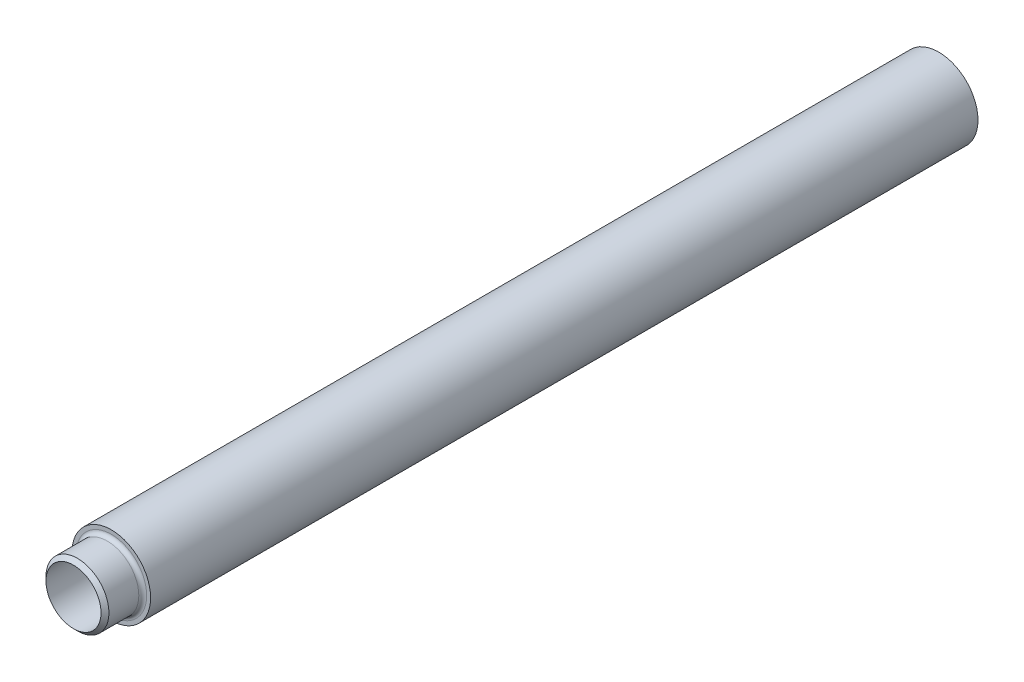
ISO-10303-21;
HEADER;
FILE_DESCRIPTION(('STEP AP214'),'2;1');
FILE_NAME('part.step','',(''),(''),'','','');
FILE_SCHEMA(('AUTOMOTIVE_DESIGN { 1 0 10303 214 1 1 1 1 }'));
ENDSEC;
DATA;
#1=APPLICATION_CONTEXT('core data for automotive mechanical design processes');
#2=APPLICATION_PROTOCOL_DEFINITION('international standard','automotive_design',2000,#1);
#3=PRODUCT_CONTEXT('',#1,'mechanical');
#4=PRODUCT('Part','Part','',(#3));
#5=PRODUCT_RELATED_PRODUCT_CATEGORY('part','',(#4));
#6=PRODUCT_DEFINITION_FORMATION('','',#4);
#7=PRODUCT_DEFINITION_CONTEXT('part definition',#1,'design');
#8=PRODUCT_DEFINITION('design','',#6,#7);
#9=PRODUCT_DEFINITION_SHAPE('','',#8);
#10=(LENGTH_UNIT() NAMED_UNIT(*) SI_UNIT(.MILLI.,.METRE.));
#11=(NAMED_UNIT(*) PLANE_ANGLE_UNIT() SI_UNIT($,.RADIAN.));
#12=(NAMED_UNIT(*) SI_UNIT($,.STERADIAN.) SOLID_ANGLE_UNIT());
#13=UNCERTAINTY_MEASURE_WITH_UNIT(LENGTH_MEASURE(1.E-05),#10,'distance_accuracy_value','');
#14=(GEOMETRIC_REPRESENTATION_CONTEXT(3) GLOBAL_UNCERTAINTY_ASSIGNED_CONTEXT((#13)) GLOBAL_UNIT_ASSIGNED_CONTEXT((#10,
#11,#12)) REPRESENTATION_CONTEXT('',''));
#15=CARTESIAN_POINT('',(0.,0.,0.));
#16=DIRECTION('',(0.,0.,1.));
#17=DIRECTION('',(1.,0.,0.));
#18=AXIS2_PLACEMENT_3D('',#15,#16,#17);
#19=CARTESIAN_POINT('',(0.,0.,279.4));
#20=DIRECTION('',(0.,0.,-1.));
#21=DIRECTION('',(-1.,0.,0.));
#22=AXIS2_PLACEMENT_3D('',#19,#20,#21);
#23=CYLINDRICAL_SURFACE('',#22,12.7);
#24=CARTESIAN_POINT('',(0.,0.,0.));
#25=DIRECTION('',(0.,0.,1.));
#26=DIRECTION('',(1.,0.,0.));
#27=AXIS2_PLACEMENT_3D('',#24,#25,#26);
#28=CIRCLE('',#27,12.7);
#29=CARTESIAN_POINT('',(12.7,0.,0.));
#30=VERTEX_POINT('',#29);
#31=EDGE_CURVE('E65',#30,#30,#28,.T.);
#32=ORIENTED_EDGE('',*,*,#31,.T.);
#33=EDGE_LOOP('',(#32));
#34=FACE_BOUND('',#33,.T.);
#35=CARTESIAN_POINT('',(0.,0.,267.208));
#36=DIRECTION('',(0.,0.,1.));
#37=DIRECTION('',(1.,0.,0.));
#38=AXIS2_PLACEMENT_3D('',#35,#36,#37);
#39=CIRCLE('',#38,12.7);
#40=CARTESIAN_POINT('',(12.7,0.,267.208));
#41=VERTEX_POINT('',#40);
#42=EDGE_CURVE('E70',#41,#41,#39,.T.);
#43=ORIENTED_EDGE('',*,*,#42,.F.);
#44=EDGE_LOOP('',(#43));
#45=FACE_BOUND('',#44,.T.);
#46=ADVANCED_FACE('F35',(#34,#45),#23,.T.);
#47=CARTESIAN_POINT('',(0.,0.,279.4));
#48=DIRECTION('',(0.,0.,-1.));
#49=DIRECTION('',(-1.,0.,0.));
#50=AXIS2_PLACEMENT_3D('',#47,#48,#49);
#51=CYLINDRICAL_SURFACE('',#50,8.89);
#52=CARTESIAN_POINT('',(0.,0.,279.4));
#53=DIRECTION('',(0.,0.,-1.));
#54=DIRECTION('',(-1.,0.,0.));
#55=AXIS2_PLACEMENT_3D('',#52,#53,#54);
#56=CIRCLE('',#55,8.89);
#57=CARTESIAN_POINT('',(-8.89,0.,279.4));
#58=VERTEX_POINT('',#57);
#59=EDGE_CURVE('E69',#58,#58,#56,.T.);
#60=ORIENTED_EDGE('',*,*,#59,.F.);
#61=EDGE_LOOP('',(#60));
#62=FACE_BOUND('',#61,.T.);
#63=CARTESIAN_POINT('',(0.,0.,12.7));
#64=DIRECTION('',(0.,0.,-1.));
#65=DIRECTION('',(-1.,0.,0.));
#66=AXIS2_PLACEMENT_3D('',#63,#64,#65);
#67=CIRCLE('',#66,8.89);
#68=CARTESIAN_POINT('',(-8.89,0.,12.7));
#69=VERTEX_POINT('',#68);
#70=EDGE_CURVE('E66',#69,#69,#67,.F.);
#71=ORIENTED_EDGE('',*,*,#70,.F.);
#72=EDGE_LOOP('',(#71));
#73=FACE_BOUND('',#72,.T.);
#74=ADVANCED_FACE('F81',(#62,#73),#51,.F.);
#75=CARTESIAN_POINT('',(0.,0.,0.));
#76=DIRECTION('',(0.,0.,1.));
#77=DIRECTION('',(1.,0.,0.));
#78=AXIS2_PLACEMENT_3D('',#75,#76,#77);
#79=PLANE('',#78);
#80=CARTESIAN_POINT('',(0.,0.,0.));
#81=DIRECTION('',(0.,0.,1.));
#82=DIRECTION('',(1.,0.,0.));
#83=AXIS2_PLACEMENT_3D('',#80,#81,#82);
#84=CIRCLE('',#83,11.303);
#85=CARTESIAN_POINT('',(11.303,0.,0.));
#86=VERTEX_POINT('',#85);
#87=EDGE_CURVE('E51',#86,#86,#84,.T.);
#88=ORIENTED_EDGE('',*,*,#87,.T.);
#89=EDGE_LOOP('',(#88));
#90=FACE_BOUND('',#89,.T.);
#91=ORIENTED_EDGE('',*,*,#31,.F.);
#92=EDGE_LOOP('',(#91));
#93=FACE_BOUND('',#92,.T.);
#94=ADVANCED_FACE('F87',(#90,#93),#79,.F.);
#95=CARTESIAN_POINT('',(0.,0.,12.7));
#96=DIRECTION('',(0.,0.,-1.));
#97=DIRECTION('',(-1.,0.,0.));
#98=AXIS2_PLACEMENT_3D('',#95,#96,#97);
#99=PLANE('',#98);
#100=CARTESIAN_POINT('',(0.,0.,12.7));
#101=DIRECTION('',(0.,0.,-1.));
#102=DIRECTION('',(-1.,0.,0.));
#103=AXIS2_PLACEMENT_3D('',#100,#101,#102);
#104=CIRCLE('',#103,9.398);
#105=CARTESIAN_POINT('',(-9.398,0.,12.7));
#106=VERTEX_POINT('',#105);
#107=EDGE_CURVE('E47',#106,#106,#104,.T.);
#108=ORIENTED_EDGE('',*,*,#107,.T.);
#109=EDGE_LOOP('',(#108));
#110=FACE_BOUND('',#109,.T.);
#111=ORIENTED_EDGE('',*,*,#70,.T.);
#112=EDGE_LOOP('',(#111));
#113=FACE_BOUND('',#112,.T.);
#114=ADVANCED_FACE('F113',(#110,#113),#99,.T.);
#115=CARTESIAN_POINT('',(0.,0.,12.7));
#116=DIRECTION('',(0.,0.,-1.));
#117=DIRECTION('',(-1.,0.,0.));
#118=AXIS2_PLACEMENT_3D('',#115,#116,#117);
#119=CYLINDRICAL_SURFACE('',#118,10.033);
#120=CARTESIAN_POINT('',(0.,0.,12.065));
#121=DIRECTION('',(0.,0.,-1.));
#122=DIRECTION('',(-1.,0.,0.));
#123=AXIS2_PLACEMENT_3D('',#120,#121,#122);
#124=CIRCLE('',#123,10.033);
#125=CARTESIAN_POINT('',(-10.033,0.,12.065));
#126=VERTEX_POINT('',#125);
#127=EDGE_CURVE('E43',#126,#126,#124,.F.);
#128=ORIENTED_EDGE('',*,*,#127,.T.);
#129=EDGE_LOOP('',(#128));
#130=FACE_BOUND('',#129,.T.);
#131=CARTESIAN_POINT('',(0.,0.,1.26999999999999));
#132=DIRECTION('',(0.,0.,1.));
#133=DIRECTION('',(1.,0.,0.));
#134=AXIS2_PLACEMENT_3D('',#131,#132,#133);
#135=CIRCLE('',#134,10.033);
#136=CARTESIAN_POINT('',(10.033,0.,1.26999999999999));
#137=VERTEX_POINT('',#136);
#138=EDGE_CURVE('E56',#137,#137,#135,.F.);
#139=ORIENTED_EDGE('',*,*,#138,.T.);
#140=EDGE_LOOP('',(#139));
#141=FACE_BOUND('',#140,.T.);
#142=ADVANCED_FACE('F116',(#130,#141),#119,.F.);
#143=CARTESIAN_POINT('',(0.,0.,267.208));
#144=DIRECTION('',(0.,0.,1.));
#145=DIRECTION('',(1.,0.,0.));
#146=AXIS2_PLACEMENT_3D('',#143,#144,#145);
#147=PLANE('',#146);
#148=CARTESIAN_POINT('',(0.,0.,267.208));
#149=DIRECTION('',(0.,0.,1.));
#150=DIRECTION('',(1.,0.,0.));
#151=AXIS2_PLACEMENT_3D('',#148,#149,#150);
#152=CIRCLE('',#151,11.43);
#153=CARTESIAN_POINT('',(11.43,0.,267.208));
#154=VERTEX_POINT('',#153);
#155=EDGE_CURVE('E59',#154,#154,#152,.F.);
#156=ORIENTED_EDGE('',*,*,#155,.T.);
#157=EDGE_LOOP('',(#156));
#158=FACE_BOUND('',#157,.T.);
#159=ORIENTED_EDGE('',*,*,#42,.T.);
#160=EDGE_LOOP('',(#159));
#161=FACE_BOUND('',#160,.T.);
#162=ADVANCED_FACE('F78',(#158,#161),#147,.T.);
#163=CARTESIAN_POINT('',(0.,0.,267.208));
#164=DIRECTION('',(0.,0.,1.));
#165=DIRECTION('',(1.,0.,0.));
#166=AXIS2_PLACEMENT_3D('',#163,#164,#165);
#167=CYLINDRICAL_SURFACE('',#166,10.16);
#168=CARTESIAN_POINT('',(0.,0.,278.13));
#169=DIRECTION('',(0.,0.,1.));
#170=DIRECTION('',(1.,0.,0.));
#171=AXIS2_PLACEMENT_3D('',#168,#169,#170);
#172=CIRCLE('',#171,10.16);
#173=CARTESIAN_POINT('',(10.16,0.,278.13));
#174=VERTEX_POINT('',#173);
#175=EDGE_CURVE('E10',#174,#174,#172,.F.);
#176=CARTESIAN_POINT('',(0.,0.,268.478));
#177=DIRECTION('',(0.,0.,1.));
#178=DIRECTION('',(1.,0.,0.));
#179=AXIS2_PLACEMENT_3D('',#176,#177,#178);
#180=CIRCLE('',#179,10.16);
#181=CARTESIAN_POINT('',(10.16,0.,268.478));
#182=VERTEX_POINT('',#181);
#183=EDGE_CURVE('E62',#182,#182,#180,.T.);
#184=CARTESIAN_POINT('',(10.16,0.,278.13));
#185=CARTESIAN_POINT('',(10.16,0.,278.029458333333));
#186=CARTESIAN_POINT('',(10.16,0.,277.928916666667));
#187=CARTESIAN_POINT('',(10.16,0.,277.727833333333));
#188=CARTESIAN_POINT('',(10.16,0.,277.627291666667));
#189=CARTESIAN_POINT('',(10.16,0.,277.426208333333));
#190=CARTESIAN_POINT('',(10.16,0.,277.325666666667));
#191=CARTESIAN_POINT('',(10.16,0.,277.124583333333));
#192=CARTESIAN_POINT('',(10.16,0.,277.024041666667));
#193=CARTESIAN_POINT('',(10.16,0.,276.822958333333));
#194=CARTESIAN_POINT('',(10.16,0.,276.722416666667));
#195=CARTESIAN_POINT('',(10.16,0.,276.521333333333));
#196=CARTESIAN_POINT('',(10.16,0.,276.420791666667));
#197=CARTESIAN_POINT('',(10.16,0.,276.219708333333));
#198=CARTESIAN_POINT('',(10.16,0.,276.119166666667));
#199=CARTESIAN_POINT('',(10.16,0.,275.918083333333));
#200=CARTESIAN_POINT('',(10.16,0.,275.817541666667));
#201=CARTESIAN_POINT('',(10.16,0.,275.616458333333));
#202=CARTESIAN_POINT('',(10.16,0.,275.515916666667));
#203=CARTESIAN_POINT('',(10.16,0.,275.314833333333));
#204=CARTESIAN_POINT('',(10.16,0.,275.214291666667));
#205=CARTESIAN_POINT('',(10.16,0.,275.013208333333));
#206=CARTESIAN_POINT('',(10.16,0.,274.912666666667));
#207=CARTESIAN_POINT('',(10.16,0.,274.711583333333));
#208=CARTESIAN_POINT('',(10.16,0.,274.611041666667));
#209=CARTESIAN_POINT('',(10.16,0.,274.409958333333));
#210=CARTESIAN_POINT('',(10.16,0.,274.309416666667));
#211=CARTESIAN_POINT('',(10.16,0.,274.108333333333));
#212=CARTESIAN_POINT('',(10.16,0.,274.007791666667));
#213=CARTESIAN_POINT('',(10.16,0.,273.806708333333));
#214=CARTESIAN_POINT('',(10.16,0.,273.706166666667));
#215=CARTESIAN_POINT('',(10.16,0.,273.505083333333));
#216=CARTESIAN_POINT('',(10.16,0.,273.404541666667));
#217=CARTESIAN_POINT('',(10.16,0.,273.203458333333));
#218=CARTESIAN_POINT('',(10.16,0.,273.102916666667));
#219=CARTESIAN_POINT('',(10.16,0.,272.901833333333));
#220=CARTESIAN_POINT('',(10.16,0.,272.801291666667));
#221=CARTESIAN_POINT('',(10.16,0.,272.600208333333));
#222=CARTESIAN_POINT('',(10.16,0.,272.499666666667));
#223=CARTESIAN_POINT('',(10.16,0.,272.298583333333));
#224=CARTESIAN_POINT('',(10.16,0.,272.198041666667));
#225=CARTESIAN_POINT('',(10.16,0.,271.996958333333));
#226=CARTESIAN_POINT('',(10.16,0.,271.896416666667));
#227=CARTESIAN_POINT('',(10.16,0.,271.695333333333));
#228=CARTESIAN_POINT('',(10.16,0.,271.594791666667));
#229=CARTESIAN_POINT('',(10.16,0.,271.393708333333));
#230=CARTESIAN_POINT('',(10.16,0.,271.293166666667));
#231=CARTESIAN_POINT('',(10.16,0.,271.092083333333));
#232=CARTESIAN_POINT('',(10.16,0.,270.991541666667));
#233=CARTESIAN_POINT('',(10.16,0.,270.790458333333));
#234=CARTESIAN_POINT('',(10.16,0.,270.689916666667));
#235=CARTESIAN_POINT('',(10.16,0.,270.488833333333));
#236=CARTESIAN_POINT('',(10.16,0.,270.388291666667));
#237=CARTESIAN_POINT('',(10.16,0.,270.187208333333));
#238=CARTESIAN_POINT('',(10.16,0.,270.086666666667));
#239=CARTESIAN_POINT('',(10.16,0.,269.885583333333));
#240=CARTESIAN_POINT('',(10.16,0.,269.785041666667));
#241=CARTESIAN_POINT('',(10.16,0.,269.583958333333));
#242=CARTESIAN_POINT('',(10.16,0.,269.483416666667));
#243=CARTESIAN_POINT('',(10.16,0.,269.282333333333));
#244=CARTESIAN_POINT('',(10.16,0.,269.181791666667));
#245=CARTESIAN_POINT('',(10.16,0.,268.980708333333));
#246=CARTESIAN_POINT('',(10.16,0.,268.880166666667));
#247=CARTESIAN_POINT('',(10.16,0.,268.679083333333));
#248=CARTESIAN_POINT('',(10.16,0.,268.578541666667));
#249=CARTESIAN_POINT('',(10.16,0.,268.478));
#250=B_SPLINE_CURVE_WITH_KNOTS('',3,(#184,#185,#186,#187,#188,#189,#190,#191,#192,#193,#194,
#195,#196,#197,#198,#199,#200,#201,#202,#203,#204,#205,#206,#207,#208,#209,#210,#211,#212,#213,
#214,#215,#216,#217,#218,#219,#220,#221,#222,#223,#224,#225,#226,#227,#228,#229,#230,#231,#232,
#233,#234,#235,#236,#237,#238,#239,#240,#241,#242,#243,#244,#245,#246,#247,#248,#249),
.UNSPECIFIED.,.F.,.F.,(4,2,2,2,2,2,2,2,2,2,2,2,2,2,2,2,2,2,2,2,2,2,2,2,2,2,2,2,2,2,2,2,4),(0.,
0.301625000000028,0.603250000000055,0.904875000000027,1.20650000000005,1.50812500000003,
1.80975000000005,2.11137500000008,2.41300000000005,2.71462500000008,3.01625000000005,
3.31787500000008,3.61950000000011,3.92112500000008,4.22275000000011,4.52437500000008,
4.82600000000011,5.12762500000014,5.42925000000011,5.73087500000014,6.03250000000011,
6.33412500000014,6.63575000000016,6.93737500000013,7.23900000000016,7.54062500000013,
7.84225000000016,8.14387500000019,8.44550000000016,8.74712500000019,9.04875000000016,
9.35037500000019,9.65200000000022),.UNSPECIFIED.);
#251=EDGE_CURVE('BSEAM96',#174,#182,#250,.T.);
#252=ORIENTED_EDGE('',*,*,#175,.T.);
#253=ORIENTED_EDGE('',*,*,#183,.T.);
#254=ORIENTED_EDGE('',*,*,#251,.T.);
#255=ORIENTED_EDGE('',*,*,#251,.F.);
#256=EDGE_LOOP('',(#252,#254,#253,#255));
#257=FACE_BOUND('',#256,.T.);
#258=ADVANCED_FACE('F96',(#257),#167,.T.);
#259=CARTESIAN_POINT('',(0.,0.,268.478));
#260=DIRECTION('',(0.,0.,1.));
#261=DIRECTION('',(1.,0.,0.));
#262=AXIS2_PLACEMENT_3D('',#259,#260,#261);
#263=TOROIDAL_SURFACE('',#262,11.43,1.27);
#264=ORIENTED_EDGE('',*,*,#155,.F.);
#265=EDGE_LOOP('',(#264));
#266=FACE_BOUND('',#265,.T.);
#267=ORIENTED_EDGE('',*,*,#183,.F.);
#268=EDGE_LOOP('',(#267));
#269=FACE_BOUND('',#268,.T.);
#270=ADVANCED_FACE('F92',(#266,#269),#263,.F.);
#271=CARTESIAN_POINT('',(0.,0.,1.26999999999999));
#272=DIRECTION('',(0.,0.,-1.));
#273=DIRECTION('',(-1.,0.,0.));
#274=AXIS2_PLACEMENT_3D('',#271,#272,#273);
#275=CONICAL_SURFACE('',#274,10.033,0.785398163397446);
#276=ORIENTED_EDGE('',*,*,#87,.F.);
#277=EDGE_LOOP('',(#276));
#278=FACE_BOUND('',#277,.T.);
#279=ORIENTED_EDGE('',*,*,#138,.F.);
#280=EDGE_LOOP('',(#279));
#281=FACE_BOUND('',#280,.T.);
#282=ADVANCED_FACE('F95',(#278,#281),#275,.F.);
#283=CARTESIAN_POINT('',(0.,0.,12.065));
#284=DIRECTION('',(0.,0.,-1.));
#285=DIRECTION('',(-1.,0.,0.));
#286=AXIS2_PLACEMENT_3D('',#283,#284,#285);
#287=TOROIDAL_SURFACE('',#286,9.398,0.635);
#288=ORIENTED_EDGE('',*,*,#127,.F.);
#289=EDGE_LOOP('',(#288));
#290=FACE_BOUND('',#289,.T.);
#291=ORIENTED_EDGE('',*,*,#107,.F.);
#292=EDGE_LOOP('',(#291));
#293=FACE_BOUND('',#292,.T.);
#294=ADVANCED_FACE('F102',(#290,#293),#287,.F.);
#295=CARTESIAN_POINT('',(0.,0.,279.4));
#296=DIRECTION('',(0.,0.,-1.));
#297=DIRECTION('',(-1.,0.,0.));
#298=AXIS2_PLACEMENT_3D('',#295,#296,#297);
#299=CONICAL_SURFACE('',#298,8.89000000000017,0.785398163397448);
#300=ORIENTED_EDGE('',*,*,#175,.F.);
#301=EDGE_LOOP('',(#300));
#302=FACE_BOUND('',#301,.T.);
#303=ORIENTED_EDGE('',*,*,#59,.T.);
#304=EDGE_LOOP('',(#303));
#305=FACE_BOUND('',#304,.T.);
#306=ADVANCED_FACE('F38',(#302,#305),#299,.T.);
#307=CLOSED_SHELL('',(#46,#74,#94,#114,#142,#162,#258,#270,#282,#294,#306));
#308=MANIFOLD_SOLID_BREP('B2',#307);
#309=ADVANCED_BREP_SHAPE_REPRESENTATION('',(#18,#308),#14);
#310=SHAPE_DEFINITION_REPRESENTATION(#9,#309);
ENDSEC;
END-ISO-10303-21;
